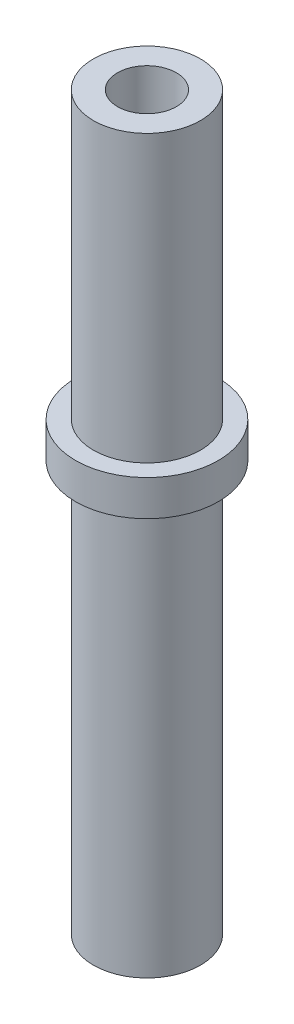
ISO-10303-21;
HEADER;
FILE_DESCRIPTION(('STEP AP214'),'2;1');
FILE_NAME('part.step','',(''),(''),'','','');
FILE_SCHEMA(('AUTOMOTIVE_DESIGN { 1 0 10303 214 1 1 1 1 }'));
ENDSEC;
DATA;
#1=APPLICATION_CONTEXT('core data for automotive mechanical design processes');
#2=APPLICATION_PROTOCOL_DEFINITION('international standard','automotive_design',2000,#1);
#3=PRODUCT_CONTEXT('',#1,'mechanical');
#4=PRODUCT('Part','Part','',(#3));
#5=PRODUCT_RELATED_PRODUCT_CATEGORY('part','',(#4));
#6=PRODUCT_DEFINITION_FORMATION('','',#4);
#7=PRODUCT_DEFINITION_CONTEXT('part definition',#1,'design');
#8=PRODUCT_DEFINITION('design','',#6,#7);
#9=PRODUCT_DEFINITION_SHAPE('','',#8);
#10=(LENGTH_UNIT() NAMED_UNIT(*) SI_UNIT(.MILLI.,.METRE.));
#11=(NAMED_UNIT(*) PLANE_ANGLE_UNIT() SI_UNIT($,.RADIAN.));
#12=(NAMED_UNIT(*) SI_UNIT($,.STERADIAN.) SOLID_ANGLE_UNIT());
#13=UNCERTAINTY_MEASURE_WITH_UNIT(LENGTH_MEASURE(1.E-05),#10,'distance_accuracy_value','');
#14=(GEOMETRIC_REPRESENTATION_CONTEXT(3) GLOBAL_UNCERTAINTY_ASSIGNED_CONTEXT((#13)) GLOBAL_UNIT_ASSIGNED_CONTEXT((#10,
#11,#12)) REPRESENTATION_CONTEXT('',''));
#15=CARTESIAN_POINT('',(0.,0.,0.));
#16=DIRECTION('',(0.,0.,1.));
#17=DIRECTION('',(1.,0.,0.));
#18=AXIS2_PLACEMENT_3D('',#15,#16,#17);
#19=CARTESIAN_POINT('',(0.,-20.5,0.));
#20=DIRECTION('',(0.,1.,0.));
#21=DIRECTION('',(0.,0.,1.));
#22=AXIS2_PLACEMENT_3D('',#19,#20,#21);
#23=CYLINDRICAL_SURFACE('',#22,3.);
#24=CARTESIAN_POINT('',(0.,4.5,0.));
#25=DIRECTION('',(0.,1.,0.));
#26=DIRECTION('',(0.,0.,1.));
#27=AXIS2_PLACEMENT_3D('',#24,#25,#26);
#28=CIRCLE('',#27,3.);
#29=CARTESIAN_POINT('',(0.,4.5,3.));
#30=VERTEX_POINT('',#29);
#31=EDGE_CURVE('E11',#30,#30,#28,.F.);
#32=ORIENTED_EDGE('',*,*,#31,.F.);
#33=EDGE_LOOP('',(#32));
#34=FACE_BOUND('',#33,.T.);
#35=CARTESIAN_POINT('',(0.,20.5,0.));
#36=DIRECTION('',(0.,1.,0.));
#37=DIRECTION('',(0.,0.,1.));
#38=AXIS2_PLACEMENT_3D('',#35,#36,#37);
#39=CIRCLE('',#38,3.);
#40=CARTESIAN_POINT('',(0.,20.5,3.));
#41=VERTEX_POINT('',#40);
#42=EDGE_CURVE('E96',#41,#41,#39,.T.);
#43=ORIENTED_EDGE('',*,*,#42,.F.);
#44=EDGE_LOOP('',(#43));
#45=FACE_BOUND('',#44,.T.);
#46=ADVANCED_FACE('F44',(#34,#45),#23,.T.);
#47=CARTESIAN_POINT('',(0.,20.5,0.));
#48=DIRECTION('',(0.,1.,0.));
#49=DIRECTION('',(0.,0.,1.));
#50=AXIS2_PLACEMENT_3D('',#47,#48,#49);
#51=PLANE('',#50);
#52=CARTESIAN_POINT('',(0.,20.5,0.));
#53=DIRECTION('',(0.,1.,0.));
#54=DIRECTION('',(0.,0.,1.));
#55=AXIS2_PLACEMENT_3D('',#52,#53,#54);
#56=CIRCLE('',#55,1.64999999999999);
#57=CARTESIAN_POINT('',(0.,20.5,1.64999999999999));
#58=VERTEX_POINT('',#57);
#59=EDGE_CURVE('E88',#58,#58,#56,.T.);
#60=ORIENTED_EDGE('',*,*,#59,.F.);
#61=EDGE_LOOP('',(#60));
#62=FACE_BOUND('',#61,.T.);
#63=ORIENTED_EDGE('',*,*,#42,.T.);
#64=EDGE_LOOP('',(#63));
#65=FACE_BOUND('',#64,.T.);
#66=ADVANCED_FACE('F129',(#62,#65),#51,.T.);
#67=CARTESIAN_POINT('',(0.,12.5,0.));
#68=DIRECTION('',(0.,1.,0.));
#69=DIRECTION('',(0.,0.,1.));
#70=AXIS2_PLACEMENT_3D('',#67,#68,#69);
#71=CONICAL_SURFACE('',#70,1.65,1.02974425867665);
#72=CARTESIAN_POINT('',(0.,11.5085799786045,0.));
#73=VERTEX_POINT('',#72);
#74=VERTEX_LOOP('',#73);
#75=FACE_BOUND('',#74,.T.);
#76=CARTESIAN_POINT('',(0.,12.5,0.));
#77=DIRECTION('',(0.,1.,0.));
#78=DIRECTION('',(0.,0.,1.));
#79=AXIS2_PLACEMENT_3D('',#76,#77,#78);
#80=CIRCLE('',#79,1.65);
#81=CARTESIAN_POINT('',(0.,12.5,1.65));
#82=VERTEX_POINT('',#81);
#83=EDGE_CURVE('E92',#82,#82,#80,.T.);
#84=ORIENTED_EDGE('',*,*,#83,.T.);
#85=EDGE_LOOP('',(#84));
#86=FACE_BOUND('',#85,.T.);
#87=ADVANCED_FACE('F124',(#75,#86),#71,.F.);
#88=CARTESIAN_POINT('',(0.,20.5,0.));
#89=DIRECTION('',(0.,1.,0.));
#90=DIRECTION('',(0.,0.,1.));
#91=AXIS2_PLACEMENT_3D('',#88,#89,#90);
#92=CYLINDRICAL_SURFACE('',#91,1.64999999999999);
#93=ORIENTED_EDGE('',*,*,#83,.F.);
#94=EDGE_LOOP('',(#93));
#95=FACE_BOUND('',#94,.T.);
#96=ORIENTED_EDGE('',*,*,#59,.T.);
#97=EDGE_LOOP('',(#96));
#98=FACE_BOUND('',#97,.T.);
#99=ADVANCED_FACE('F115',(#95,#98),#92,.F.);
#100=CARTESIAN_POINT('',(0.,4.5,0.));
#101=DIRECTION('',(0.,-1.,0.));
#102=DIRECTION('',(0.,0.,-1.));
#103=AXIS2_PLACEMENT_3D('',#100,#101,#102);
#104=CYLINDRICAL_SURFACE('',#103,4.);
#105=CARTESIAN_POINT('',(0.,4.5,0.));
#106=DIRECTION('',(0.,1.,0.));
#107=DIRECTION('',(0.,0.,1.));
#108=AXIS2_PLACEMENT_3D('',#105,#106,#107);
#109=CIRCLE('',#108,4.);
#110=CARTESIAN_POINT('',(0.,4.5,4.));
#111=VERTEX_POINT('',#110);
#112=EDGE_CURVE('E78',#111,#111,#109,.T.);
#113=ORIENTED_EDGE('',*,*,#112,.F.);
#114=EDGE_LOOP('',(#113));
#115=FACE_BOUND('',#114,.T.);
#116=CARTESIAN_POINT('',(0.,2.5,0.));
#117=DIRECTION('',(0.,1.,0.));
#118=DIRECTION('',(0.,0.,1.));
#119=AXIS2_PLACEMENT_3D('',#116,#117,#118);
#120=CIRCLE('',#119,4.);
#121=CARTESIAN_POINT('',(0.,2.5,4.));
#122=VERTEX_POINT('',#121);
#123=EDGE_CURVE('E71',#122,#122,#120,.T.);
#124=ORIENTED_EDGE('',*,*,#123,.T.);
#125=EDGE_LOOP('',(#124));
#126=FACE_BOUND('',#125,.T.);
#127=ADVANCED_FACE('F113',(#115,#126),#104,.T.);
#128=CARTESIAN_POINT('',(0.,4.5,0.));
#129=DIRECTION('',(0.,1.,0.));
#130=DIRECTION('',(0.,0.,1.));
#131=AXIS2_PLACEMENT_3D('',#128,#129,#130);
#132=PLANE('',#131);
#133=ORIENTED_EDGE('',*,*,#31,.T.);
#134=EDGE_LOOP('',(#133));
#135=FACE_BOUND('',#134,.T.);
#136=ORIENTED_EDGE('',*,*,#112,.T.);
#137=EDGE_LOOP('',(#136));
#138=FACE_BOUND('',#137,.T.);
#139=ADVANCED_FACE('F109',(#135,#138),#132,.T.);
#140=CARTESIAN_POINT('',(0.,2.5,0.));
#141=DIRECTION('',(0.,1.,0.));
#142=DIRECTION('',(0.,0.,1.));
#143=AXIS2_PLACEMENT_3D('',#140,#141,#142);
#144=PLANE('',#143);
#145=CARTESIAN_POINT('',(0.,2.5,0.));
#146=DIRECTION('',(0.,1.,0.));
#147=DIRECTION('',(0.,0.,1.));
#148=AXIS2_PLACEMENT_3D('',#145,#146,#147);
#149=CIRCLE('',#148,3.);
#150=CARTESIAN_POINT('',(0.,2.5,3.));
#151=VERTEX_POINT('',#150);
#152=EDGE_CURVE('E86',#151,#151,#149,.F.);
#153=ORIENTED_EDGE('',*,*,#152,.F.);
#154=EDGE_LOOP('',(#153));
#155=FACE_BOUND('',#154,.T.);
#156=ORIENTED_EDGE('',*,*,#123,.F.);
#157=EDGE_LOOP('',(#156));
#158=FACE_BOUND('',#157,.T.);
#159=ADVANCED_FACE('F105',(#155,#158),#144,.F.);
#160=CARTESIAN_POINT('',(0.,-20.5,0.));
#161=DIRECTION('',(0.,1.,0.));
#162=DIRECTION('',(0.,0.,1.));
#163=AXIS2_PLACEMENT_3D('',#160,#161,#162);
#164=PLANE('',#163);
#165=CARTESIAN_POINT('',(0.,-20.5,0.));
#166=DIRECTION('',(0.,-1.,0.));
#167=DIRECTION('',(0.,0.,-1.));
#168=AXIS2_PLACEMENT_3D('',#165,#166,#167);
#169=CIRCLE('',#168,1.64999999999999);
#170=CARTESIAN_POINT('',(0.,-20.5,-1.64999999999999));
#171=VERTEX_POINT('',#170);
#172=EDGE_CURVE('E72',#171,#171,#169,.T.);
#173=ORIENTED_EDGE('',*,*,#172,.F.);
#174=EDGE_LOOP('',(#173));
#175=FACE_BOUND('',#174,.T.);
#176=CARTESIAN_POINT('',(0.,-20.5,0.));
#177=DIRECTION('',(0.,1.,0.));
#178=DIRECTION('',(0.,0.,1.));
#179=AXIS2_PLACEMENT_3D('',#176,#177,#178);
#180=CIRCLE('',#179,3.);
#181=CARTESIAN_POINT('',(0.,-20.5,3.));
#182=VERTEX_POINT('',#181);
#183=EDGE_CURVE('E52',#182,#182,#180,.T.);
#184=ORIENTED_EDGE('',*,*,#183,.F.);
#185=EDGE_LOOP('',(#184));
#186=FACE_BOUND('',#185,.T.);
#187=ADVANCED_FACE('F108',(#175,#186),#164,.F.);
#188=ORIENTED_EDGE('',*,*,#183,.T.);
#189=EDGE_LOOP('',(#188));
#190=FACE_BOUND('',#189,.T.);
#191=ORIENTED_EDGE('',*,*,#152,.T.);
#192=EDGE_LOOP('',(#191));
#193=FACE_BOUND('',#192,.T.);
#194=ADVANCED_FACE('F64',(#190,#193),#23,.T.);
#195=CARTESIAN_POINT('',(0.,-12.5,0.));
#196=DIRECTION('',(0.,-1.,0.));
#197=DIRECTION('',(0.,0.,-1.));
#198=AXIS2_PLACEMENT_3D('',#195,#196,#197);
#199=CONICAL_SURFACE('',#198,1.65,1.02974425867665);
#200=CARTESIAN_POINT('',(0.,-11.5085799786045,0.));
#201=VERTEX_POINT('',#200);
#202=VERTEX_LOOP('',#201);
#203=FACE_BOUND('',#202,.T.);
#204=CARTESIAN_POINT('',(0.,-12.5,0.));
#205=DIRECTION('',(0.,-1.,0.));
#206=DIRECTION('',(0.,0.,-1.));
#207=AXIS2_PLACEMENT_3D('',#204,#205,#206);
#208=CIRCLE('',#207,1.65);
#209=CARTESIAN_POINT('',(0.,-12.5,-1.65));
#210=VERTEX_POINT('',#209);
#211=EDGE_CURVE('E68',#210,#210,#208,.T.);
#212=ORIENTED_EDGE('',*,*,#211,.T.);
#213=EDGE_LOOP('',(#212));
#214=FACE_BOUND('',#213,.T.);
#215=ADVANCED_FACE('F60',(#203,#214),#199,.F.);
#216=CARTESIAN_POINT('',(0.,-20.5,0.));
#217=DIRECTION('',(0.,-1.,0.));
#218=DIRECTION('',(0.,0.,-1.));
#219=AXIS2_PLACEMENT_3D('',#216,#217,#218);
#220=CYLINDRICAL_SURFACE('',#219,1.64999999999999);
#221=ORIENTED_EDGE('',*,*,#211,.F.);
#222=EDGE_LOOP('',(#221));
#223=FACE_BOUND('',#222,.T.);
#224=ORIENTED_EDGE('',*,*,#172,.T.);
#225=EDGE_LOOP('',(#224));
#226=FACE_BOUND('',#225,.T.);
#227=ADVANCED_FACE('F63',(#223,#226),#220,.F.);
#228=CLOSED_SHELL('',(#46,#66,#87,#99,#127,#139,#159,#187,#194,#215,#227));
#229=MANIFOLD_SOLID_BREP('B2',#228);
#230=ADVANCED_BREP_SHAPE_REPRESENTATION('',(#18,#229),#14);
#231=SHAPE_DEFINITION_REPRESENTATION(#9,#230);
ENDSEC;
END-ISO-10303-21;
